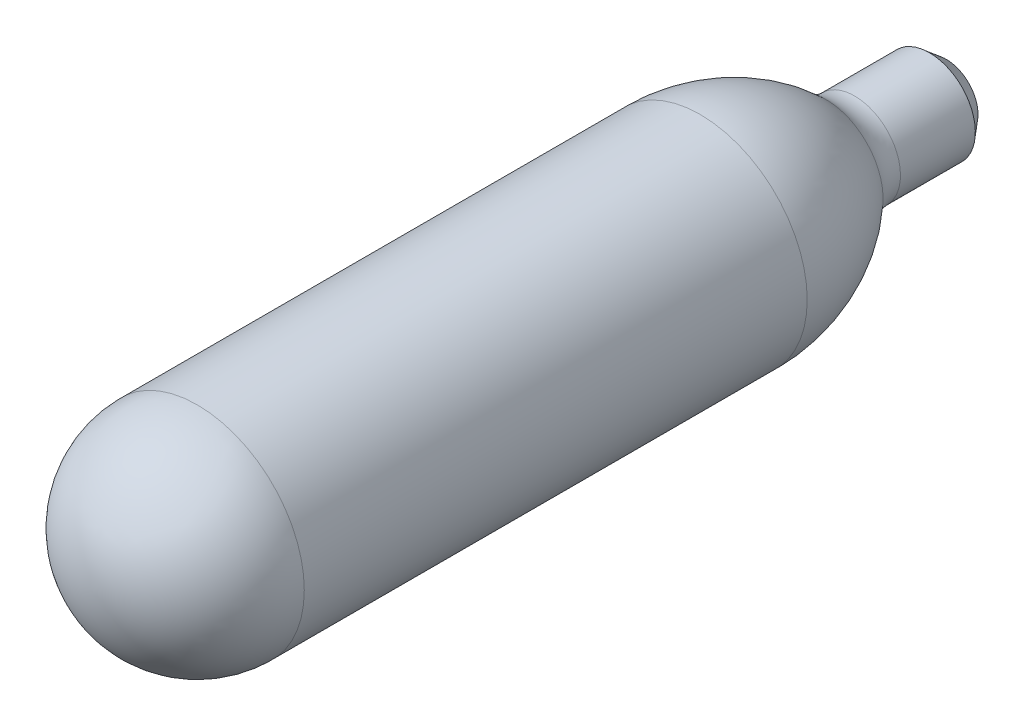
ISO-10303-21;
HEADER;
FILE_DESCRIPTION(('STEP AP214'),'2;1');
FILE_NAME('part.step','',(''),(''),'','','');
FILE_SCHEMA(('AUTOMOTIVE_DESIGN { 1 0 10303 214 1 1 1 1 }'));
ENDSEC;
DATA;
#1=APPLICATION_CONTEXT('core data for automotive mechanical design processes');
#2=APPLICATION_PROTOCOL_DEFINITION('international standard','automotive_design',2000,#1);
#3=PRODUCT_CONTEXT('',#1,'mechanical');
#4=PRODUCT('Part','Part','',(#3));
#5=PRODUCT_RELATED_PRODUCT_CATEGORY('part','',(#4));
#6=PRODUCT_DEFINITION_FORMATION('','',#4);
#7=PRODUCT_DEFINITION_CONTEXT('part definition',#1,'design');
#8=PRODUCT_DEFINITION('design','',#6,#7);
#9=PRODUCT_DEFINITION_SHAPE('','',#8);
#10=(LENGTH_UNIT() NAMED_UNIT(*) SI_UNIT(.MILLI.,.METRE.));
#11=(NAMED_UNIT(*) PLANE_ANGLE_UNIT() SI_UNIT($,.RADIAN.));
#12=(NAMED_UNIT(*) SI_UNIT($,.STERADIAN.) SOLID_ANGLE_UNIT());
#13=UNCERTAINTY_MEASURE_WITH_UNIT(LENGTH_MEASURE(1.E-05),#10,'distance_accuracy_value','');
#14=(GEOMETRIC_REPRESENTATION_CONTEXT(3) GLOBAL_UNCERTAINTY_ASSIGNED_CONTEXT((#13)) GLOBAL_UNIT_ASSIGNED_CONTEXT((#10,
#11,#12)) REPRESENTATION_CONTEXT('',''));
#15=CARTESIAN_POINT('',(0.,0.,0.));
#16=DIRECTION('',(0.,0.,1.));
#17=DIRECTION('',(1.,0.,0.));
#18=AXIS2_PLACEMENT_3D('',#15,#16,#17);
#19=CARTESIAN_POINT('',(0.,4.36998042115544,-24.9016393225711));
#20=DIRECTION('',(0.,0.,1.));
#21=DIRECTION('',(0.,-1.,0.));
#22=AXIS2_PLACEMENT_3D('',#19,#20,#21);
#23=DEGENERATE_TOROIDAL_SURFACE('',#22,7.9375,19.05,.F.);
#24=CARTESIAN_POINT('',(0.,4.36998042115544,-24.9016393225711));
#25=DIRECTION('',(0.,0.,1.));
#26=DIRECTION('',(0.,-1.,0.));
#27=AXIS2_PLACEMENT_3D('',#24,#25,#26);
#28=CIRCLE('',#27,11.1125);
#29=CARTESIAN_POINT('',(0.,-6.74251957884456,-24.9016393225711));
#30=VERTEX_POINT('',#29);
#31=EDGE_CURVE('E55',#30,#30,#28,.T.);
#32=ORIENTED_EDGE('',*,*,#31,.F.);
#33=EDGE_LOOP('',(#32));
#34=FACE_BOUND('',#33,.T.);
#35=CARTESIAN_POINT('',(0.,4.36998042115544,-37.9460940672463));
#36=DIRECTION('',(0.,0.,1.));
#37=DIRECTION('',(0.,-1.,0.));
#38=AXIS2_PLACEMENT_3D('',#35,#36,#37);
#39=CIRCLE('',#38,5.94575251567952);
#40=CARTESIAN_POINT('',(0.,-1.57577209452407,-37.9460940672463));
#41=VERTEX_POINT('',#40);
#42=EDGE_CURVE('E86',#41,#41,#39,.T.);
#43=ORIENTED_EDGE('',*,*,#42,.T.);
#44=EDGE_LOOP('',(#43));
#45=FACE_BOUND('',#44,.T.);
#46=ADVANCED_FACE('F38',(#34,#45),#23,.F.);
#47=CARTESIAN_POINT('',(0.,4.36998042115544,38.4415557788813));
#48=DIRECTION('',(0.,0.,1.));
#49=DIRECTION('',(0.,-1.,0.));
#50=AXIS2_PLACEMENT_3D('',#47,#48,#49);
#51=CYLINDRICAL_SURFACE('',#50,11.1125);
#52=CARTESIAN_POINT('',(0.,4.36998042115544,27.3290557788813));
#53=DIRECTION('',(0.,0.,1.));
#54=DIRECTION('',(0.,-1.,0.));
#55=AXIS2_PLACEMENT_3D('',#52,#53,#54);
#56=CIRCLE('',#55,11.1125);
#57=CARTESIAN_POINT('',(0.,-6.74251957884456,27.3290557788813));
#58=VERTEX_POINT('',#57);
#59=EDGE_CURVE('E70',#58,#58,#56,.T.);
#60=ORIENTED_EDGE('',*,*,#59,.F.);
#61=EDGE_LOOP('',(#60));
#62=FACE_BOUND('',#61,.T.);
#63=ORIENTED_EDGE('',*,*,#31,.T.);
#64=EDGE_LOOP('',(#63));
#65=FACE_BOUND('',#64,.T.);
#66=ADVANCED_FACE('F116',(#62,#65),#51,.T.);
#67=CARTESIAN_POINT('',(0.,4.36998042115545,27.3290557788813));
#68=DIRECTION('',(0.,0.,1.));
#69=DIRECTION('',(0.,1.,0.));
#70=AXIS2_PLACEMENT_3D('',#67,#68,#69);
#71=SPHERICAL_SURFACE('',#70,11.1125);
#72=ORIENTED_EDGE('',*,*,#59,.T.);
#73=EDGE_LOOP('',(#72));
#74=FACE_BOUND('',#73,.T.);
#75=ADVANCED_FACE('F111',(#74),#71,.T.);
#76=CARTESIAN_POINT('',(0.,4.36998042115544,-50.4584442211187));
#77=DIRECTION('',(0.,0.,1.));
#78=DIRECTION('',(0.,-1.,0.));
#79=AXIS2_PLACEMENT_3D('',#76,#77,#78);
#80=PLANE('',#79);
#81=CARTESIAN_POINT('',(0.,4.36998042115544,-50.4584442211187));
#82=DIRECTION('',(0.,0.,1.));
#83=DIRECTION('',(0.,-1.,0.));
#84=AXIS2_PLACEMENT_3D('',#81,#82,#83);
#85=CIRCLE('',#84,3.29308752425657);
#86=CARTESIAN_POINT('',(0.,1.07689289689887,-50.4584442211187));
#87=VERTEX_POINT('',#86);
#88=EDGE_CURVE('E74',#87,#87,#85,.T.);
#89=ORIENTED_EDGE('',*,*,#88,.F.);
#90=EDGE_LOOP('',(#89));
#91=FACE_BOUND('',#90,.T.);
#92=ADVANCED_FACE('F106',(#91),#80,.F.);
#93=CARTESIAN_POINT('',(0.,4.36998042115544,-50.4584442211187));
#94=DIRECTION('',(0.,0.,1.));
#95=DIRECTION('',(0.,-1.,0.));
#96=AXIS2_PLACEMENT_3D('',#93,#94,#95);
#97=CONICAL_SURFACE('',#96,3.29308752425657,0.698131700797737);
#98=CARTESIAN_POINT('',(0.,4.36998042115544,-48.7072666241487));
#99=DIRECTION('',(0.,0.,1.));
#100=DIRECTION('',(0.,-1.,0.));
#101=AXIS2_PLACEMENT_3D('',#98,#99,#100);
#102=CIRCLE('',#101,4.7625);
#103=CARTESIAN_POINT('',(0.,-0.392519578844555,-48.7072666241487));
#104=VERTEX_POINT('',#103);
#105=EDGE_CURVE('E78',#104,#104,#102,.T.);
#106=ORIENTED_EDGE('',*,*,#105,.F.);
#107=EDGE_LOOP('',(#106));
#108=FACE_BOUND('',#107,.T.);
#109=ORIENTED_EDGE('',*,*,#88,.T.);
#110=EDGE_LOOP('',(#109));
#111=FACE_BOUND('',#110,.T.);
#112=ADVANCED_FACE('F100',(#108,#111),#97,.T.);
#113=CARTESIAN_POINT('',(0.,4.36998042115544,38.4415557788813));
#114=DIRECTION('',(0.,0.,1.));
#115=DIRECTION('',(0.,-1.,0.));
#116=AXIS2_PLACEMENT_3D('',#113,#114,#115);
#117=CYLINDRICAL_SURFACE('',#116,4.7625);
#118=CARTESIAN_POINT('',(0.,4.36998042115544,-40.9334442211187));
#119=DIRECTION('',(0.,0.,1.));
#120=DIRECTION('',(0.,-1.,0.));
#121=AXIS2_PLACEMENT_3D('',#118,#119,#120);
#122=CIRCLE('',#121,4.7625);
#123=CARTESIAN_POINT('',(0.,-0.392519578844555,-40.9334442211187));
#124=VERTEX_POINT('',#123);
#125=EDGE_CURVE('E83',#124,#124,#122,.T.);
#126=ORIENTED_EDGE('',*,*,#125,.F.);
#127=EDGE_LOOP('',(#126));
#128=FACE_BOUND('',#127,.T.);
#129=ORIENTED_EDGE('',*,*,#105,.T.);
#130=EDGE_LOOP('',(#129));
#131=FACE_BOUND('',#130,.T.);
#132=ADVANCED_FACE('F94',(#128,#131),#117,.T.);
#133=CARTESIAN_POINT('',(0.,4.36998042115544,-40.9334442211187));
#134=DIRECTION('',(0.,0.,1.));
#135=DIRECTION('',(0.,-1.,0.));
#136=AXIS2_PLACEMENT_3D('',#133,#134,#135);
#137=TOROIDAL_SURFACE('',#136,9.12519829173961,4.3626982917396);
#138=ORIENTED_EDGE('',*,*,#42,.F.);
#139=EDGE_LOOP('',(#138));
#140=FACE_BOUND('',#139,.T.);
#141=ORIENTED_EDGE('',*,*,#125,.T.);
#142=EDGE_LOOP('',(#141));
#143=FACE_BOUND('',#142,.T.);
#144=ADVANCED_FACE('F91',(#140,#143),#137,.F.);
#145=CLOSED_SHELL('',(#46,#66,#75,#92,#112,#132,#144));
#146=CARTESIAN_POINT('',(0.,4.36998042115544,-24.9016393225711));
#147=DIRECTION('',(0.,0.,1.));
#148=DIRECTION('',(0.,-1.,0.));
#149=AXIS2_PLACEMENT_3D('',#146,#147,#148);
#150=DEGENERATE_TOROIDAL_SURFACE('',#149,7.9375,16.51,.F.);
#151=CARTESIAN_POINT('',(0.,4.36998042115544,-24.9016393225711));
#152=DIRECTION('',(0.,0.,1.));
#153=DIRECTION('',(0.,-1.,0.));
#154=AXIS2_PLACEMENT_3D('',#151,#152,#153);
#155=CIRCLE('',#154,8.5725);
#156=CARTESIAN_POINT('',(0.,-4.20251957884456,-24.9016393225711));
#157=VERTEX_POINT('',#156);
#158=EDGE_CURVE('E62',#157,#157,#155,.T.);
#159=ORIENTED_EDGE('',*,*,#158,.T.);
#160=EDGE_LOOP('',(#159));
#161=FACE_BOUND('',#160,.T.);
#162=CARTESIAN_POINT('',(0.,4.36998042115544,-36.2068334346229));
#163=DIRECTION('',(0.,0.,1.));
#164=DIRECTION('',(0.,-1.,0.));
#165=AXIS2_PLACEMENT_3D('',#162,#163,#164);
#166=CIRCLE('',#165,4.09465218025558);
#167=CARTESIAN_POINT('',(0.,0.275328240899863,-36.2068334346229));
#168=VERTEX_POINT('',#167);
#169=EDGE_CURVE('E42',#168,#168,#166,.T.);
#170=ORIENTED_EDGE('',*,*,#169,.F.);
#171=EDGE_LOOP('',(#170));
#172=FACE_BOUND('',#171,.T.);
#173=ADVANCED_FACE('F127',(#161,#172),#150,.T.);
#174=CARTESIAN_POINT('',(0.,4.36998042115544,38.4415557788813));
#175=DIRECTION('',(0.,0.,1.));
#176=DIRECTION('',(0.,-1.,0.));
#177=AXIS2_PLACEMENT_3D('',#174,#175,#176);
#178=CYLINDRICAL_SURFACE('',#177,8.5725);
#179=CARTESIAN_POINT('',(0.,4.36998042115545,27.3290557788813));
#180=DIRECTION('',(0.,0.,1.));
#181=DIRECTION('',(0.,-1.,0.));
#182=AXIS2_PLACEMENT_3D('',#179,#180,#181);
#183=CIRCLE('',#182,8.5725);
#184=CARTESIAN_POINT('',(0.,-4.20251957884455,27.3290557788813));
#185=VERTEX_POINT('',#184);
#186=EDGE_CURVE('E60',#185,#185,#183,.T.);
#187=ORIENTED_EDGE('',*,*,#186,.T.);
#188=EDGE_LOOP('',(#187));
#189=FACE_BOUND('',#188,.T.);
#190=ORIENTED_EDGE('',*,*,#158,.F.);
#191=EDGE_LOOP('',(#190));
#192=FACE_BOUND('',#191,.T.);
#193=ADVANCED_FACE('F130',(#189,#192),#178,.F.);
#194=CARTESIAN_POINT('',(0.,4.36998042115545,27.3290557788813));
#195=DIRECTION('',(0.,0.,1.));
#196=DIRECTION('',(0.,1.,0.));
#197=AXIS2_PLACEMENT_3D('',#194,#195,#196);
#198=SPHERICAL_SURFACE('',#197,8.5725);
#199=ORIENTED_EDGE('',*,*,#186,.F.);
#200=EDGE_LOOP('',(#199));
#201=FACE_BOUND('',#200,.T.);
#202=ADVANCED_FACE('F134',(#201),#198,.F.);
#203=CARTESIAN_POINT('',(0.,4.36998042115544,-47.9184442211187));
#204=DIRECTION('',(0.,0.,1.));
#205=DIRECTION('',(0.,-1.,0.));
#206=AXIS2_PLACEMENT_3D('',#203,#204,#205);
#207=PLANE('',#206);
#208=CARTESIAN_POINT('',(0.,4.36998042115544,-47.9184442211187));
#209=DIRECTION('',(0.,0.,1.));
#210=DIRECTION('',(0.,-1.,0.));
#211=AXIS2_PLACEMENT_3D('',#208,#209,#210);
#212=CIRCLE('',#211,2.10866607254287);
#213=CARTESIAN_POINT('',(0.,2.26131434861257,-47.9184442211187));
#214=VERTEX_POINT('',#213);
#215=EDGE_CURVE('E52',#214,#214,#212,.T.);
#216=ORIENTED_EDGE('',*,*,#215,.T.);
#217=EDGE_LOOP('',(#216));
#218=FACE_BOUND('',#217,.T.);
#219=ADVANCED_FACE('F138',(#218),#207,.T.);
#220=CARTESIAN_POINT('',(0.,4.36998042115544,-48.8257636925148));
#221=DIRECTION('',(0.,0.,1.));
#222=DIRECTION('',(0.,-1.,0.));
#223=AXIS2_PLACEMENT_3D('',#220,#221,#222);
#224=CONICAL_SURFACE('',#223,1.34733463873437,0.698131700797737);
#225=CARTESIAN_POINT('',(0.,4.36998042115544,-47.7827822291125));
#226=DIRECTION('',(0.,0.,1.));
#227=DIRECTION('',(0.,-1.,0.));
#228=AXIS2_PLACEMENT_3D('',#225,#226,#227);
#229=CIRCLE('',#228,2.2225);
#230=CARTESIAN_POINT('',(0.,2.14748042115545,-47.7827822291125));
#231=VERTEX_POINT('',#230);
#232=EDGE_CURVE('E47',#231,#231,#229,.T.);
#233=ORIENTED_EDGE('',*,*,#232,.T.);
#234=EDGE_LOOP('',(#233));
#235=FACE_BOUND('',#234,.T.);
#236=ORIENTED_EDGE('',*,*,#215,.F.);
#237=EDGE_LOOP('',(#236));
#238=FACE_BOUND('',#237,.T.);
#239=ADVANCED_FACE('F142',(#235,#238),#224,.F.);
#240=CARTESIAN_POINT('',(0.,4.36998042115544,38.4415557788813));
#241=DIRECTION('',(0.,0.,1.));
#242=DIRECTION('',(0.,-1.,0.));
#243=AXIS2_PLACEMENT_3D('',#240,#241,#242);
#244=CYLINDRICAL_SURFACE('',#243,2.2225);
#245=CARTESIAN_POINT('',(0.,4.36998042115544,-40.9334442211187));
#246=DIRECTION('',(0.,0.,1.));
#247=DIRECTION('',(0.,-1.,0.));
#248=AXIS2_PLACEMENT_3D('',#245,#246,#247);
#249=CIRCLE('',#248,2.2225);
#250=CARTESIAN_POINT('',(0.,2.14748042115544,-40.9334442211187));
#251=VERTEX_POINT('',#250);
#252=EDGE_CURVE('E10',#251,#251,#249,.T.);
#253=ORIENTED_EDGE('',*,*,#252,.T.);
#254=EDGE_LOOP('',(#253));
#255=FACE_BOUND('',#254,.T.);
#256=ORIENTED_EDGE('',*,*,#232,.F.);
#257=EDGE_LOOP('',(#256));
#258=FACE_BOUND('',#257,.T.);
#259=ADVANCED_FACE('F145',(#255,#258),#244,.F.);
#260=CARTESIAN_POINT('',(0.,4.36998042115544,-40.9334442211187));
#261=DIRECTION('',(0.,0.,1.));
#262=DIRECTION('',(0.,-1.,0.));
#263=AXIS2_PLACEMENT_3D('',#260,#261,#262);
#264=TOROIDAL_SURFACE('',#263,9.12519829173961,6.9026982917396);
#265=ORIENTED_EDGE('',*,*,#169,.T.);
#266=EDGE_LOOP('',(#265));
#267=FACE_BOUND('',#266,.T.);
#268=ORIENTED_EDGE('',*,*,#252,.F.);
#269=EDGE_LOOP('',(#268));
#270=FACE_BOUND('',#269,.T.);
#271=ADVANCED_FACE('F40',(#267,#270),#264,.T.);
#272=CLOSED_SHELL('',(#173,#193,#202,#219,#239,#259,#271));
#273=ORIENTED_CLOSED_SHELL('',*,#272,.T.);
#274=BREP_WITH_VOIDS('B2',#145,(#273));
#275=ADVANCED_BREP_SHAPE_REPRESENTATION('',(#18,#274),#14);
#276=SHAPE_DEFINITION_REPRESENTATION(#9,#275);
ENDSEC;
END-ISO-10303-21;
